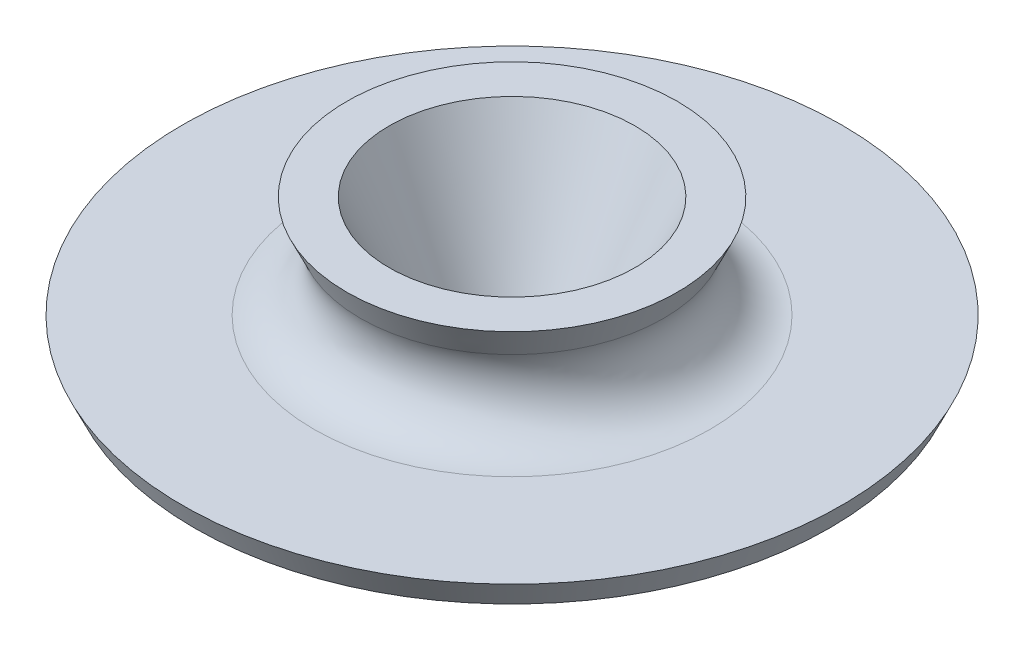
ISO-10303-21;
HEADER;
FILE_DESCRIPTION(('STEP AP214'),'2;1');
FILE_NAME('part.step','',(''),(''),'','','');
FILE_SCHEMA(('AUTOMOTIVE_DESIGN { 1 0 10303 214 1 1 1 1 }'));
ENDSEC;
DATA;
#1=APPLICATION_CONTEXT('core data for automotive mechanical design processes');
#2=APPLICATION_PROTOCOL_DEFINITION('international standard','automotive_design',2000,#1);
#3=PRODUCT_CONTEXT('',#1,'mechanical');
#4=PRODUCT('Part','Part','',(#3));
#5=PRODUCT_RELATED_PRODUCT_CATEGORY('part','',(#4));
#6=PRODUCT_DEFINITION_FORMATION('','',#4);
#7=PRODUCT_DEFINITION_CONTEXT('part definition',#1,'design');
#8=PRODUCT_DEFINITION('design','',#6,#7);
#9=PRODUCT_DEFINITION_SHAPE('','',#8);
#10=(LENGTH_UNIT() NAMED_UNIT(*) SI_UNIT(.MILLI.,.METRE.));
#11=(NAMED_UNIT(*) PLANE_ANGLE_UNIT() SI_UNIT($,.RADIAN.));
#12=(NAMED_UNIT(*) SI_UNIT($,.STERADIAN.) SOLID_ANGLE_UNIT());
#13=UNCERTAINTY_MEASURE_WITH_UNIT(LENGTH_MEASURE(1.E-05),#10,'distance_accuracy_value','');
#14=(GEOMETRIC_REPRESENTATION_CONTEXT(3) GLOBAL_UNCERTAINTY_ASSIGNED_CONTEXT((#13)) GLOBAL_UNIT_ASSIGNED_CONTEXT((#10,
#11,#12)) REPRESENTATION_CONTEXT('',''));
#15=CARTESIAN_POINT('',(0.,0.,0.));
#16=DIRECTION('',(0.,0.,1.));
#17=DIRECTION('',(1.,0.,0.));
#18=AXIS2_PLACEMENT_3D('',#15,#16,#17);
#19=CARTESIAN_POINT('',(0.,0.,0.));
#20=DIRECTION('',(0.,1.,0.));
#21=DIRECTION('',(0.,0.,1.));
#22=AXIS2_PLACEMENT_3D('',#19,#20,#21);
#23=CONICAL_SURFACE('',#22,12.7,0.436332312998576);
#24=CARTESIAN_POINT('',(0.,38.1,0.));
#25=DIRECTION('',(0.,-1.,0.));
#26=DIRECTION('',(0.,0.,-1.));
#27=AXIS2_PLACEMENT_3D('',#24,#25,#26);
#28=CIRCLE('',#27,30.4663217757052);
#29=CARTESIAN_POINT('',(0.,38.1,-30.4663217757052));
#30=VERTEX_POINT('',#29);
#31=EDGE_CURVE('E77',#30,#30,#28,.T.);
#32=ORIENTED_EDGE('',*,*,#31,.F.);
#33=EDGE_LOOP('',(#32));
#34=FACE_BOUND('',#33,.T.);
#35=CARTESIAN_POINT('',(0.,0.,0.));
#36=DIRECTION('',(0.,-1.,0.));
#37=DIRECTION('',(0.,0.,-1.));
#38=AXIS2_PLACEMENT_3D('',#35,#36,#37);
#39=CIRCLE('',#38,12.7);
#40=CARTESIAN_POINT('',(0.,0.,-12.7));
#41=VERTEX_POINT('',#40);
#42=EDGE_CURVE('E50',#41,#41,#39,.T.);
#43=ORIENTED_EDGE('',*,*,#42,.T.);
#44=EDGE_LOOP('',(#43));
#45=FACE_BOUND('',#44,.T.);
#46=ADVANCED_FACE('F37',(#34,#45),#23,.F.);
#47=CARTESIAN_POINT('',(-12.7,0.,0.));
#48=DIRECTION('',(0.,1.,0.));
#49=DIRECTION('',(0.,0.,1.));
#50=AXIS2_PLACEMENT_3D('',#47,#48,#49);
#51=PLANE('',#50);
#52=ORIENTED_EDGE('',*,*,#42,.F.);
#53=EDGE_LOOP('',(#52));
#54=FACE_BOUND('',#53,.T.);
#55=CARTESIAN_POINT('',(0.,0.,0.));
#56=DIRECTION('',(0.,-1.,0.));
#57=DIRECTION('',(0.,0.,-1.));
#58=AXIS2_PLACEMENT_3D('',#55,#56,#57);
#59=CIRCLE('',#58,19.7064497854118);
#60=CARTESIAN_POINT('',(0.,0.,-19.7064497854118));
#61=VERTEX_POINT('',#60);
#62=EDGE_CURVE('E55',#61,#61,#59,.T.);
#63=ORIENTED_EDGE('',*,*,#62,.T.);
#64=EDGE_LOOP('',(#63));
#65=FACE_BOUND('',#64,.T.);
#66=ADVANCED_FACE('F86',(#54,#65),#51,.F.);
#67=CARTESIAN_POINT('',(0.,6.35,0.));
#68=DIRECTION('',(0.,1.,0.));
#69=DIRECTION('',(0.,0.,1.));
#70=AXIS2_PLACEMENT_3D('',#67,#68,#69);
#71=CONICAL_SURFACE('',#70,22.667503414696,0.436332312998577);
#72=ORIENTED_EDGE('',*,*,#62,.F.);
#73=EDGE_LOOP('',(#72));
#74=FACE_BOUND('',#73,.T.);
#75=CARTESIAN_POINT('',(0.,6.35,0.));
#76=DIRECTION('',(0.,-1.,0.));
#77=DIRECTION('',(0.,0.,-1.));
#78=AXIS2_PLACEMENT_3D('',#75,#76,#77);
#79=CIRCLE('',#78,22.667503414696);
#80=CARTESIAN_POINT('',(0.,6.35,-22.667503414696));
#81=VERTEX_POINT('',#80);
#82=EDGE_CURVE('E61',#81,#81,#79,.T.);
#83=ORIENTED_EDGE('',*,*,#82,.T.);
#84=EDGE_LOOP('',(#83));
#85=FACE_BOUND('',#84,.T.);
#86=ADVANCED_FACE('F91',(#74,#85),#71,.T.);
#87=CARTESIAN_POINT('',(-22.667503414696,6.35,0.));
#88=DIRECTION('',(0.,1.,0.));
#89=DIRECTION('',(0.,0.,1.));
#90=AXIS2_PLACEMENT_3D('',#87,#88,#89);
#91=PLANE('',#90);
#92=ORIENTED_EDGE('',*,*,#82,.F.);
#93=EDGE_LOOP('',(#92));
#94=FACE_BOUND('',#93,.T.);
#95=CARTESIAN_POINT('',(0.,6.34999999999999,0.));
#96=DIRECTION('',(0.,-1.,0.));
#97=DIRECTION('',(0.,0.,-1.));
#98=AXIS2_PLACEMENT_3D('',#95,#96,#97);
#99=CIRCLE('',#98,78.7191016979904);
#100=CARTESIAN_POINT('',(0.,6.34999999999999,-78.7191016979904));
#101=VERTEX_POINT('',#100);
#102=EDGE_CURVE('E65',#101,#101,#99,.T.);
#103=ORIENTED_EDGE('',*,*,#102,.T.);
#104=EDGE_LOOP('',(#103));
#105=FACE_BOUND('',#104,.T.);
#106=ADVANCED_FACE('F97',(#94,#105),#91,.F.);
#107=CARTESIAN_POINT('',(0.,12.7,0.));
#108=DIRECTION('',(0.,1.,0.));
#109=DIRECTION('',(0.,0.,1.));
#110=AXIS2_PLACEMENT_3D('',#107,#108,#109);
#111=CONICAL_SURFACE('',#110,81.6801553272746,0.436332312998578);
#112=ORIENTED_EDGE('',*,*,#102,.F.);
#113=EDGE_LOOP('',(#112));
#114=FACE_BOUND('',#113,.T.);
#115=CARTESIAN_POINT('',(0.,12.7,0.));
#116=DIRECTION('',(0.,-1.,0.));
#117=DIRECTION('',(0.,0.,-1.));
#118=AXIS2_PLACEMENT_3D('',#115,#116,#117);
#119=CIRCLE('',#118,81.6801553272746);
#120=CARTESIAN_POINT('',(0.,12.7,-81.6801553272746));
#121=VERTEX_POINT('',#120);
#122=EDGE_CURVE('E69',#121,#121,#119,.T.);
#123=ORIENTED_EDGE('',*,*,#122,.T.);
#124=EDGE_LOOP('',(#123));
#125=FACE_BOUND('',#124,.T.);
#126=ADVANCED_FACE('F103',(#114,#125),#111,.T.);
#127=CARTESIAN_POINT('',(-81.6801553272746,12.7,0.));
#128=DIRECTION('',(0.,-1.,0.));
#129=DIRECTION('',(0.,0.,-1.));
#130=AXIS2_PLACEMENT_3D('',#127,#128,#129);
#131=PLANE('',#130);
#132=CARTESIAN_POINT('',(0.,12.7,0.));
#133=DIRECTION('',(0.,-1.,0.));
#134=DIRECTION('',(0.,0.,-1.));
#135=AXIS2_PLACEMENT_3D('',#132,#133,#134);
#136=CIRCLE('',#135,49.0667887660781);
#137=CARTESIAN_POINT('',(0.,12.7,-49.0667887660781));
#138=VERTEX_POINT('',#137);
#139=EDGE_CURVE('E45',#138,#138,#136,.T.);
#140=ORIENTED_EDGE('',*,*,#139,.T.);
#141=EDGE_LOOP('',(#140));
#142=FACE_BOUND('',#141,.T.);
#143=ORIENTED_EDGE('',*,*,#122,.F.);
#144=EDGE_LOOP('',(#143));
#145=FACE_BOUND('',#144,.T.);
#146=ADVANCED_FACE('F109',(#142,#145),#131,.F.);
#147=CARTESIAN_POINT('',(0.,38.1,0.));
#148=DIRECTION('',(0.,1.,0.));
#149=DIRECTION('',(0.,0.,1.));
#150=AXIS2_PLACEMENT_3D('',#147,#148,#149);
#151=CONICAL_SURFACE('',#150,40.9759964538229,0.436332312998577);
#152=CARTESIAN_POINT('',(0.,30.7672519241068,0.));
#153=DIRECTION('',(0.,1.,0.));
#154=DIRECTION('',(0.,0.,1.));
#155=AXIS2_PLACEMENT_3D('',#152,#153,#154);
#156=CIRCLE('',#155,37.5566798707126);
#157=CARTESIAN_POINT('',(0.,30.7672519241068,37.5566798707126));
#158=VERTEX_POINT('',#157);
#159=EDGE_CURVE('E10',#158,#158,#156,.T.);
#160=ORIENTED_EDGE('',*,*,#159,.T.);
#161=EDGE_LOOP('',(#160));
#162=FACE_BOUND('',#161,.T.);
#163=CARTESIAN_POINT('',(0.,38.1,0.));
#164=DIRECTION('',(0.,-1.,0.));
#165=DIRECTION('',(0.,0.,-1.));
#166=AXIS2_PLACEMENT_3D('',#163,#164,#165);
#167=CIRCLE('',#166,40.9759964538229);
#168=CARTESIAN_POINT('',(0.,38.1,-40.9759964538229));
#169=VERTEX_POINT('',#168);
#170=EDGE_CURVE('E73',#169,#169,#167,.T.);
#171=ORIENTED_EDGE('',*,*,#170,.T.);
#172=EDGE_LOOP('',(#171));
#173=FACE_BOUND('',#172,.T.);
#174=ADVANCED_FACE('F114',(#162,#173),#151,.T.);
#175=CARTESIAN_POINT('',(-40.9759964538229,38.1,0.));
#176=DIRECTION('',(0.,-1.,0.));
#177=DIRECTION('',(0.,0.,-1.));
#178=AXIS2_PLACEMENT_3D('',#175,#176,#177);
#179=PLANE('',#178);
#180=ORIENTED_EDGE('',*,*,#170,.F.);
#181=EDGE_LOOP('',(#180));
#182=FACE_BOUND('',#181,.T.);
#183=ORIENTED_EDGE('',*,*,#31,.T.);
#184=EDGE_LOOP('',(#183));
#185=FACE_BOUND('',#184,.T.);
#186=ADVANCED_FACE('F82',(#182,#185),#179,.F.);
#187=CARTESIAN_POINT('',(0.,25.4,0.));
#188=DIRECTION('',(0.,-1.,0.));
#189=DIRECTION('',(0.,0.,-1.));
#190=AXIS2_PLACEMENT_3D('',#187,#188,#189);
#191=TOROIDAL_SURFACE('',#190,49.0667887660781,12.7);
#192=ORIENTED_EDGE('',*,*,#159,.F.);
#193=EDGE_LOOP('',(#192));
#194=FACE_BOUND('',#193,.T.);
#195=ORIENTED_EDGE('',*,*,#139,.F.);
#196=EDGE_LOOP('',(#195));
#197=FACE_BOUND('',#196,.T.);
#198=ADVANCED_FACE('F39',(#194,#197),#191,.F.);
#199=CLOSED_SHELL('',(#46,#66,#86,#106,#126,#146,#174,#186,#198));
#200=MANIFOLD_SOLID_BREP('B2',#199);
#201=ADVANCED_BREP_SHAPE_REPRESENTATION('',(#18,#200),#14);
#202=SHAPE_DEFINITION_REPRESENTATION(#9,#201);
ENDSEC;
END-ISO-10303-21;
